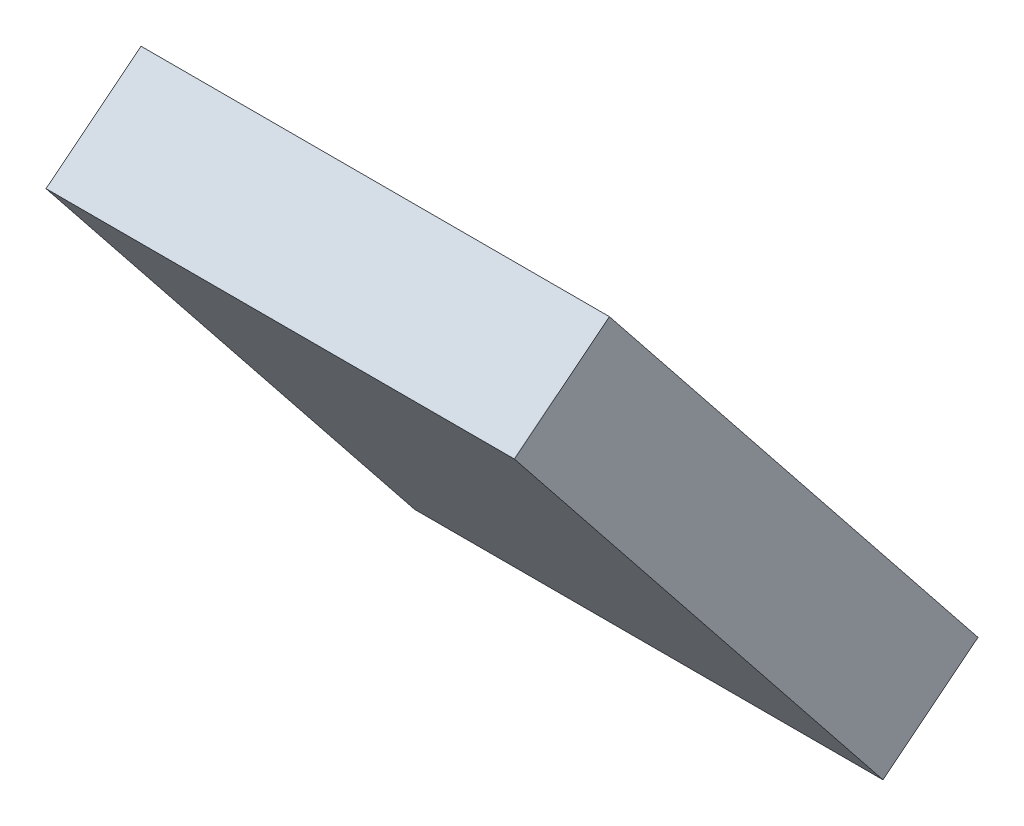
ISO-10303-21;
HEADER;
FILE_DESCRIPTION(('STEP AP214'),'2;1');
FILE_NAME('part.step','',(''),(''),'','','');
FILE_SCHEMA(('AUTOMOTIVE_DESIGN { 1 0 10303 214 1 1 1 1 }'));
ENDSEC;
DATA;
#1=APPLICATION_CONTEXT('core data for automotive mechanical design processes');
#2=APPLICATION_PROTOCOL_DEFINITION('international standard','automotive_design',2000,#1);
#3=PRODUCT_CONTEXT('',#1,'mechanical');
#4=PRODUCT('Part','Part','',(#3));
#5=PRODUCT_RELATED_PRODUCT_CATEGORY('part','',(#4));
#6=PRODUCT_DEFINITION_FORMATION('','',#4);
#7=PRODUCT_DEFINITION_CONTEXT('part definition',#1,'design');
#8=PRODUCT_DEFINITION('design','',#6,#7);
#9=PRODUCT_DEFINITION_SHAPE('','',#8);
#10=(LENGTH_UNIT() NAMED_UNIT(*) SI_UNIT(.MILLI.,.METRE.));
#11=(NAMED_UNIT(*) PLANE_ANGLE_UNIT() SI_UNIT($,.RADIAN.));
#12=(NAMED_UNIT(*) SI_UNIT($,.STERADIAN.) SOLID_ANGLE_UNIT());
#13=UNCERTAINTY_MEASURE_WITH_UNIT(LENGTH_MEASURE(1.E-05),#10,'distance_accuracy_value','');
#14=(GEOMETRIC_REPRESENTATION_CONTEXT(3) GLOBAL_UNCERTAINTY_ASSIGNED_CONTEXT((#13)) GLOBAL_UNIT_ASSIGNED_CONTEXT((#10,
#11,#12)) REPRESENTATION_CONTEXT('',''));
#15=CARTESIAN_POINT('',(0.,0.,0.));
#16=DIRECTION('',(0.,0.,1.));
#17=DIRECTION('',(1.,0.,0.));
#18=AXIS2_PLACEMENT_3D('',#15,#16,#17);
#19=CARTESIAN_POINT('',(-392.796966999625,-76.5119213000356,-69.9869694941648));
#20=DIRECTION('',(0.,-0.781749432604839,-0.623592675247242));
#21=DIRECTION('',(0.,0.623592675247242,-0.781749432604838));
#22=AXIS2_PLACEMENT_3D('',#19,#20,#21);
#23=PLANE('',#22);
#24=DIRECTION('',(0.,-0.623592675247242,0.781749432604838));
#25=VECTOR('',#24,1.);
#26=CARTESIAN_POINT('',(-322.3,-75.2647359495411,-71.5504683593746));
#27=LINE('',#26,#25);
#28=CARTESIAN_POINT('',(-322.3,-76.5119213000357,-69.9869694941649));
#29=VERTEX_POINT('',#28);
#30=CARTESIAN_POINT('',(-322.3,-79.0062920010246,-66.8599717637455));
#31=VERTEX_POINT('',#30);
#32=EDGE_CURVE('E110',#29,#31,#27,.T.);
#33=ORIENTED_EDGE('',*,*,#32,.F.);
#34=DIRECTION('',(1.,0.,0.));
#35=VECTOR('',#34,1.);
#36=CARTESIAN_POINT('',(-392.796966999625,-76.5119213000356,-69.9869694941648));
#37=LINE('',#36,#35);
#38=CARTESIAN_POINT('',(-306.89,-76.5119213000357,-69.9869694941649));
#39=VERTEX_POINT('',#38);
#40=EDGE_CURVE('E70',#29,#39,#37,.T.);
#41=ORIENTED_EDGE('',*,*,#40,.T.);
#42=DIRECTION('',(0.,-0.623592675247242,0.781749432604838));
#43=VECTOR('',#42,1.);
#44=CARTESIAN_POINT('',(-306.89,-79.9487386232164,-65.6785000412519));
#45=LINE('',#44,#43);
#46=CARTESIAN_POINT('',(-306.89,-79.0062920010246,-66.8599717637455));
#47=VERTEX_POINT('',#46);
#48=EDGE_CURVE('E108',#47,#39,#45,.F.);
#49=ORIENTED_EDGE('',*,*,#48,.F.);
#50=DIRECTION('',(-1.,0.,0.));
#51=VECTOR('',#50,1.);
#52=CARTESIAN_POINT('',(-258.7,-79.0062920010245,-66.8599717637455));
#53=LINE('',#52,#51);
#54=EDGE_CURVE('E125',#47,#31,#53,.T.);
#55=ORIENTED_EDGE('',*,*,#54,.T.);
#56=EDGE_LOOP('',(#33,#41,#49,#55));
#57=FACE_BOUND('',#56,.T.);
#58=ADVANCED_FACE('F42',(#57),#23,.T.);
#59=CARTESIAN_POINT('',(-392.796966999625,-61.073396129291,-57.6718326848965));
#60=DIRECTION('',(0.,0.623592675247241,-0.781749432604839));
#61=DIRECTION('',(0.,0.78174943260484,0.623592675247241));
#62=AXIS2_PLACEMENT_3D('',#59,#60,#61);
#63=PLANE('',#62);
#64=DIRECTION('',(0.,-0.78174943260484,-0.623592675247241));
#65=VECTOR('',#64,1.);
#66=CARTESIAN_POINT('',(-322.3,-61.073396129291,-57.6718326848965));
#67=LINE('',#66,#65);
#68=CARTESIAN_POINT('',(-322.3,-61.3079209590725,-57.8589104874707));
#69=VERTEX_POINT('',#68);
#70=EDGE_CURVE('E104',#69,#29,#67,.T.);
#71=ORIENTED_EDGE('',*,*,#70,.F.);
#72=DIRECTION('',(-1.,0.,0.));
#73=VECTOR('',#72,1.);
#74=CARTESIAN_POINT('',(-322.3,-61.3079209590725,-57.8589104874707));
#75=LINE('',#74,#73);
#76=CARTESIAN_POINT('',(-306.89,-61.3079209590725,-57.8589104874707));
#77=VERTEX_POINT('',#76);
#78=EDGE_CURVE('E94',#69,#77,#75,.F.);
#79=ORIENTED_EDGE('',*,*,#78,.T.);
#80=DIRECTION('',(0.,0.78174943260484,0.623592675247241));
#81=VECTOR('',#80,1.);
#82=CARTESIAN_POINT('',(-306.89,-61.073396129291,-57.6718326848965));
#83=LINE('',#82,#81);
#84=EDGE_CURVE('E103',#39,#77,#83,.T.);
#85=ORIENTED_EDGE('',*,*,#84,.F.);
#86=ORIENTED_EDGE('',*,*,#40,.F.);
#87=EDGE_LOOP('',(#71,#79,#85,#86));
#88=FACE_BOUND('',#87,.T.);
#89=ADVANCED_FACE('F44',(#88),#63,.T.);
#90=CARTESIAN_POINT('',(-330.7,-66.5322973271817,-56.9096073819482));
#91=DIRECTION('',(0.,0.623592675247241,-0.781749432604839));
#92=DIRECTION('',(0.,0.78174943260484,0.623592675247241));
#93=AXIS2_PLACEMENT_3D('',#90,#91,#92);
#94=PLANE('',#93);
#95=DIRECTION('',(1.,0.,0.));
#96=VECTOR('',#95,1.);
#97=CARTESIAN_POINT('',(-330.7,-63.8022916600614,-54.7319127570514));
#98=LINE('',#97,#96);
#99=CARTESIAN_POINT('',(-322.3,-63.8022916600614,-54.7319127570514));
#100=VERTEX_POINT('',#99);
#101=CARTESIAN_POINT('',(-306.89,-63.8022916600615,-54.7319127570513));
#102=VERTEX_POINT('',#101);
#103=EDGE_CURVE('E11',#100,#102,#98,.T.);
#104=ORIENTED_EDGE('',*,*,#103,.F.);
#105=DIRECTION('',(0.,-0.78174943260484,-0.623592675247241));
#106=VECTOR('',#105,1.);
#107=CARTESIAN_POINT('',(-322.3,-66.5322973271817,-56.9096073819482));
#108=LINE('',#107,#106);
#109=EDGE_CURVE('E122',#100,#31,#108,.T.);
#110=ORIENTED_EDGE('',*,*,#109,.T.);
#111=ORIENTED_EDGE('',*,*,#54,.F.);
#112=DIRECTION('',(0.,0.78174943260484,0.623592675247241));
#113=VECTOR('',#112,1.);
#114=CARTESIAN_POINT('',(-306.89,-66.5322973271817,-56.9096073819482));
#115=LINE('',#114,#113);
#116=EDGE_CURVE('E51',#47,#102,#115,.T.);
#117=ORIENTED_EDGE('',*,*,#116,.T.);
#118=EDGE_LOOP('',(#104,#110,#111,#117));
#119=FACE_BOUND('',#118,.T.);
#120=ADVANCED_FACE('F131',(#119),#94,.F.);
#121=CARTESIAN_POINT('',(-306.89,-56.4962556450713,-46.9707197838346));
#122=DIRECTION('',(-1.,0.,0.));
#123=DIRECTION('',(0.,0.,1.));
#124=AXIS2_PLACEMENT_3D('',#121,#122,#123);
#125=PLANE('',#124);
#126=DIRECTION('',(0.,0.623592675247241,-0.78174943260484));
#127=VECTOR('',#126,1.);
#128=CARTESIAN_POINT('',(-306.89,-386.430774690043,349.722218220114));
#129=LINE('',#128,#127);
#130=EDGE_CURVE('E91',#102,#77,#129,.T.);
#131=ORIENTED_EDGE('',*,*,#130,.F.);
#132=ORIENTED_EDGE('',*,*,#116,.F.);
#133=ORIENTED_EDGE('',*,*,#48,.T.);
#134=ORIENTED_EDGE('',*,*,#84,.T.);
#135=EDGE_LOOP('',(#131,#132,#133,#134));
#136=FACE_BOUND('',#135,.T.);
#137=ADVANCED_FACE('F107',(#136),#125,.F.);
#138=CARTESIAN_POINT('',(-322.3,-51.812252971396,-52.8426881019573));
#139=DIRECTION('',(1.,0.,0.));
#140=DIRECTION('',(0.,0.,-1.));
#141=AXIS2_PLACEMENT_3D('',#138,#139,#140);
#142=PLANE('',#141);
#143=DIRECTION('',(0.,0.623592675247241,-0.78174943260484));
#144=VECTOR('',#143,1.);
#145=CARTESIAN_POINT('',(-322.3,-386.430774690043,349.722218220114));
#146=LINE('',#145,#144);
#147=EDGE_CURVE('E59',#100,#69,#146,.T.);
#148=ORIENTED_EDGE('',*,*,#147,.T.);
#149=ORIENTED_EDGE('',*,*,#70,.T.);
#150=ORIENTED_EDGE('',*,*,#32,.T.);
#151=ORIENTED_EDGE('',*,*,#109,.F.);
#152=EDGE_LOOP('',(#148,#149,#150,#151));
#153=FACE_BOUND('',#152,.T.);
#154=ADVANCED_FACE('F134',(#153),#142,.F.);
#155=CARTESIAN_POINT('',(-322.3,-386.430774690043,349.722218220114));
#156=DIRECTION('',(0.,0.78174943260484,0.623592675247241));
#157=DIRECTION('',(0.,-0.623592675247241,0.78174943260484));
#158=AXIS2_PLACEMENT_3D('',#155,#156,#157);
#159=PLANE('',#158);
#160=ORIENTED_EDGE('',*,*,#103,.T.);
#161=ORIENTED_EDGE('',*,*,#130,.T.);
#162=ORIENTED_EDGE('',*,*,#78,.F.);
#163=ORIENTED_EDGE('',*,*,#147,.F.);
#164=EDGE_LOOP('',(#160,#161,#162,#163));
#165=FACE_BOUND('',#164,.T.);
#166=ADVANCED_FACE('F93',(#165),#159,.T.);
#167=CLOSED_SHELL('',(#58,#89,#120,#137,#154,#166));
#168=MANIFOLD_SOLID_BREP('B2',#167);
#169=ADVANCED_BREP_SHAPE_REPRESENTATION('',(#18,#168),#14);
#170=SHAPE_DEFINITION_REPRESENTATION(#9,#169);
ENDSEC;
END-ISO-10303-21;
